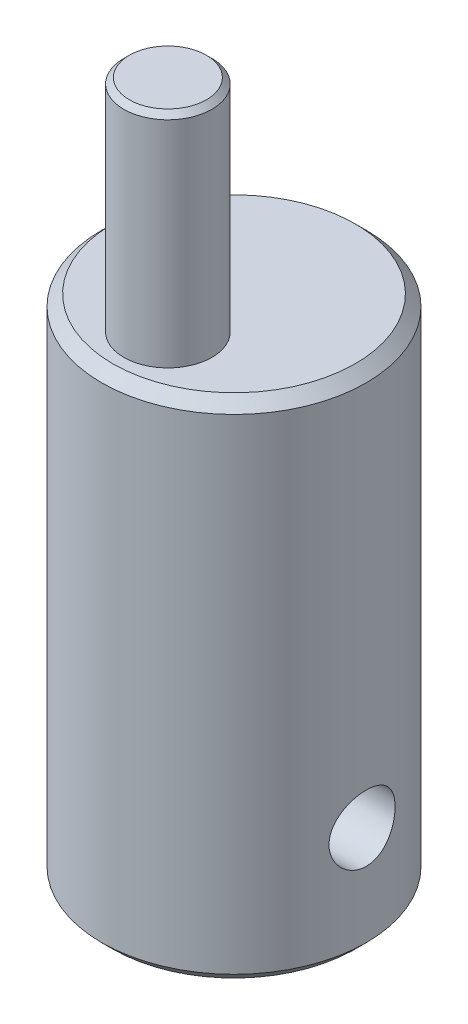
ISO-10303-21;
HEADER;
FILE_DESCRIPTION(('STEP AP214'),'2;1');
FILE_NAME('part.step','',(''),(''),'','','');
FILE_SCHEMA(('AUTOMOTIVE_DESIGN { 1 0 10303 214 1 1 1 1 }'));
ENDSEC;
DATA;
#1=APPLICATION_CONTEXT('core data for automotive mechanical design processes');
#2=APPLICATION_PROTOCOL_DEFINITION('international standard','automotive_design',2000,#1);
#3=PRODUCT_CONTEXT('',#1,'mechanical');
#4=PRODUCT('Part','Part','',(#3));
#5=PRODUCT_RELATED_PRODUCT_CATEGORY('part','',(#4));
#6=PRODUCT_DEFINITION_FORMATION('','',#4);
#7=PRODUCT_DEFINITION_CONTEXT('part definition',#1,'design');
#8=PRODUCT_DEFINITION('design','',#6,#7);
#9=PRODUCT_DEFINITION_SHAPE('','',#8);
#10=(LENGTH_UNIT() NAMED_UNIT(*) SI_UNIT(.MILLI.,.METRE.));
#11=(NAMED_UNIT(*) PLANE_ANGLE_UNIT() SI_UNIT($,.RADIAN.));
#12=(NAMED_UNIT(*) SI_UNIT($,.STERADIAN.) SOLID_ANGLE_UNIT());
#13=UNCERTAINTY_MEASURE_WITH_UNIT(LENGTH_MEASURE(1.E-05),#10,'distance_accuracy_value','');
#14=(GEOMETRIC_REPRESENTATION_CONTEXT(3) GLOBAL_UNCERTAINTY_ASSIGNED_CONTEXT((#13)) GLOBAL_UNIT_ASSIGNED_CONTEXT((#10,
#11,#12)) REPRESENTATION_CONTEXT('',''));
#15=CARTESIAN_POINT('',(0.,0.,0.));
#16=DIRECTION('',(0.,0.,1.));
#17=DIRECTION('',(1.,0.,0.));
#18=AXIS2_PLACEMENT_3D('',#15,#16,#17);
#19=CARTESIAN_POINT('',(0.,23.,0.));
#20=DIRECTION('',(0.,-1.,0.));
#21=DIRECTION('',(0.,0.,-1.));
#22=AXIS2_PLACEMENT_3D('',#19,#20,#21);
#23=CYLINDRICAL_SURFACE('',#22,6.);
#24=CARTESIAN_POINT('',(0.,0.5,0.));
#25=DIRECTION('',(0.,1.,0.));
#26=DIRECTION('',(0.,0.,1.));
#27=AXIS2_PLACEMENT_3D('',#24,#25,#26);
#28=CIRCLE('',#27,6.);
#29=CARTESIAN_POINT('',(0.,0.5,6.));
#30=VERTEX_POINT('',#29);
#31=EDGE_CURVE('E52',#30,#30,#28,.T.);
#32=ORIENTED_EDGE('',*,*,#31,.T.);
#33=EDGE_LOOP('',(#32));
#34=FACE_BOUND('',#33,.T.);
#35=CARTESIAN_POINT('',(0.,22.5,0.));
#36=DIRECTION('',(0.,1.,0.));
#37=DIRECTION('',(0.,0.,1.));
#38=AXIS2_PLACEMENT_3D('',#35,#36,#37);
#39=CIRCLE('',#38,6.);
#40=CARTESIAN_POINT('',(0.,22.5,6.));
#41=VERTEX_POINT('',#40);
#42=EDGE_CURVE('E57',#41,#41,#39,.F.);
#43=ORIENTED_EDGE('',*,*,#42,.T.);
#44=EDGE_LOOP('',(#43));
#45=FACE_BOUND('',#44,.T.);
#46=CARTESIAN_POINT('',(-5.80947501931113,5.,-1.5));
#47=CARTESIAN_POINT('',(-5.80947660051185,5.08283045055477,-1.49999764715507));
#48=CARTESIAN_POINT('',(-5.81126583608348,5.1656869392068,-1.49311574729838));
#49=CARTESIAN_POINT('',(-5.81821117195949,5.32902054690442,-1.46581387527848));
#50=CARTESIAN_POINT('',(-5.82336923173088,5.409496252681,-1.44538602404532));
#51=CARTESIAN_POINT('',(-5.8364323475758,5.56568212291222,-1.39169471977917));
#52=CARTESIAN_POINT('',(-5.84433385614245,5.6413982932314,-1.35844783671268));
#53=CARTESIAN_POINT('',(-5.86198915217285,5.78618651152395,-1.28011268475685));
#54=CARTESIAN_POINT('',(-5.87174301827101,5.85525827724814,-1.23502391313642));
#55=CARTESIAN_POINT('',(-5.89224429813367,5.98631698715732,-1.13322505638713));
#56=CARTESIAN_POINT('',(-5.90300758573818,6.04813616021003,-1.07630213262243));
#57=CARTESIAN_POINT('',(-5.92417725309178,6.16145683661621,-0.952909238460399));
#58=CARTESIAN_POINT('',(-5.93458359939834,6.21295737537305,-0.886438376508184));
#59=CARTESIAN_POINT('',(-5.95404249312349,6.30486528057877,-0.744687120647372));
#60=CARTESIAN_POINT('',(-5.96307412440355,6.34510783289688,-0.669296745717072));
#61=CARTESIAN_POINT('',(-5.97858487155591,6.41228578649185,-0.512557910575657));
#62=CARTESIAN_POINT('',(-5.98506436400607,6.43922315114931,-0.431210331475164));
#63=CARTESIAN_POINT('',(-5.99462855308908,6.47848870074715,-0.266615255252496));
#64=CARTESIAN_POINT('',(-5.99777936306589,6.49110178659595,-0.183439631729385));
#65=CARTESIAN_POINT('',(-6.00056156464379,6.50225502756533,-0.0160972915576611));
#66=CARTESIAN_POINT('',(-6.00019347658022,6.50079726332576,0.0680692767228416));
#67=CARTESIAN_POINT('',(-5.99602856972121,6.48405508984991,0.233028370758581));
#68=CARTESIAN_POINT('',(-5.99230801404524,6.46907820496769,0.313854323401601));
#69=CARTESIAN_POINT('',(-5.98194501914912,6.4262172379709,0.47180737112053));
#70=CARTESIAN_POINT('',(-5.97530242439065,6.39833246877355,0.548934269055657));
#71=CARTESIAN_POINT('',(-5.95972505820537,6.33019845758776,0.69811005525271));
#72=CARTESIAN_POINT('',(-5.95077011817032,6.28983977320295,0.770106764649757));
#73=CARTESIAN_POINT('',(-5.9315394228579,6.19798659253025,0.906413433510733));
#74=CARTESIAN_POINT('',(-5.92126343791494,6.14649015886363,0.970722052628258));
#75=CARTESIAN_POINT('',(-5.90018228261712,6.03217475481057,1.09166105262743));
#76=CARTESIAN_POINT('',(-5.88937031715551,5.96908706459134,1.1480365186128));
#77=CARTESIAN_POINT('',(-5.86869026110024,5.83424001587585,1.24946456394453));
#78=CARTESIAN_POINT('',(-5.85882221463582,5.7624802523054,1.29451661406902));
#79=CARTESIAN_POINT('',(-5.84112298098989,5.61182597951062,1.3721821935339));
#80=CARTESIAN_POINT('',(-5.83330190235432,5.53289856181208,1.40473435045574));
#81=CARTESIAN_POINT('',(-5.82071184083974,5.37044871915413,1.45602843095451));
#82=CARTESIAN_POINT('',(-5.81594220486131,5.28692728161012,1.47477330982936));
#83=CARTESIAN_POINT('',(-5.81013213623485,5.12002429908613,1.49749778319911));
#84=CARTESIAN_POINT('',(-5.80899653456189,5.03669732400222,1.50185428435178));
#85=CARTESIAN_POINT('',(-5.81032406088624,4.8705068380531,1.49671019430933));
#86=CARTESIAN_POINT('',(-5.8127868576076,4.78764328522926,1.48721087870928));
#87=CARTESIAN_POINT('',(-5.82094249172736,4.62613144102718,1.4549552783626));
#88=CARTESIAN_POINT('',(-5.82658182140625,4.54743636405749,1.43241844096905));
#89=CARTESIAN_POINT('',(-5.84040430962577,4.39494112528899,1.37497084900237));
#90=CARTESIAN_POINT('',(-5.84858776949168,4.3211415445668,1.34005862862753));
#91=CARTESIAN_POINT('',(-5.86677682255958,4.17893523327959,1.25806240076193));
#92=CARTESIAN_POINT('',(-5.87681501163985,4.11066269597414,1.21075305230138));
#93=CARTESIAN_POINT('',(-5.8975024984303,3.98288698231919,1.10559043940168));
#94=CARTESIAN_POINT('',(-5.90815189637082,3.92338525000996,1.04773544220816));
#95=CARTESIAN_POINT('',(-5.92918441818964,3.81331337445743,0.921394081477089));
#96=CARTESIAN_POINT('',(-5.93955421237102,3.76300396247071,0.852677928797389));
#97=CARTESIAN_POINT('',(-5.95858329968241,3.67463847982925,0.707554024042013));
#98=CARTESIAN_POINT('',(-5.96724268202376,3.63658177003508,0.631146673436387));
#99=CARTESIAN_POINT('',(-5.98182069442989,3.57413237928324,0.473337302596636));
#100=CARTESIAN_POINT('',(-5.98775898013446,3.54964142937256,0.391976071541822));
#101=CARTESIAN_POINT('',(-5.99631176037473,3.51472379923495,0.226124640478212));
#102=CARTESIAN_POINT('',(-5.99892689636045,3.50429440475657,0.141635047561866));
#103=CARTESIAN_POINT('',(-6.00051254113217,3.4979486156367,-0.0256252896649892));
#104=CARTESIAN_POINT('',(-5.99957968320012,3.50164743635691,-0.108380740449049));
#105=CARTESIAN_POINT('',(-5.99438844686135,3.5225717409415,-0.272051244622109));
#106=CARTESIAN_POINT('',(-5.99013016735643,3.53979682251965,-0.35296635267133));
#107=CARTESIAN_POINT('',(-5.97878149280944,3.58707832965639,-0.510256553467224));
#108=CARTESIAN_POINT('',(-5.97170646753999,3.61706517997194,-0.586653741871528));
#109=CARTESIAN_POINT('',(-5.95546933370076,3.68895586852899,-0.733375579562202));
#110=CARTESIAN_POINT('',(-5.94630696206604,3.73086120900435,-0.803699461897577));
#111=CARTESIAN_POINT('',(-5.92660874521999,3.82657285099561,-0.938102892635849));
#112=CARTESIAN_POINT('',(-5.91604525418417,3.88064021436107,-1.00199248245088));
#113=CARTESIAN_POINT('',(-5.89485973579863,3.9986342779607,-1.11992253040688));
#114=CARTESIAN_POINT('',(-5.88423769428834,4.06256347414686,-1.17396048760228));
#115=CARTESIAN_POINT('',(-5.86391213790822,4.199902121302,-1.27164303971884));
#116=CARTESIAN_POINT('',(-5.85422945594827,4.27346618511894,-1.31507492916982));
#117=CARTESIAN_POINT('',(-5.83715933325924,4.42708323488405,-1.3888903449235));
#118=CARTESIAN_POINT('',(-5.82977022370054,4.50713144916011,-1.41928336463958));
#119=CARTESIAN_POINT('',(-5.81927863109675,4.65586551774007,-1.46163379284816));
#120=CARTESIAN_POINT('',(-5.8156299450082,4.72383974657579,-1.47598975589307));
#121=CARTESIAN_POINT('',(-5.81072757878358,4.86120330349995,-1.4951734388599));
#122=CARTESIAN_POINT('',(-5.80947369434945,4.93059251036759,-1.50000197155828));
#123=CARTESIAN_POINT('',(-5.80947501931113,5.,-1.5));
#124=B_SPLINE_CURVE_WITH_KNOTS('',3,(#46,#47,#48,#49,#50,#51,#52,#53,#54,#55,#56,#57,#58,#59,
#60,#61,#62,#63,#64,#65,#66,#67,#68,#69,#70,#71,#72,#73,#74,#75,#76,#77,#78,#79,#80,#81,#82,#83,
#84,#85,#86,#87,#88,#89,#90,#91,#92,#93,#94,#95,#96,#97,#98,#99,#100,#101,#102,#103,#104,#105,
#106,#107,#108,#109,#110,#111,#112,#113,#114,#115,#116,#117,#118,#119,#120,#121,#122,#123),
.UNSPECIFIED.,.T.,.F.,(4,2,2,2,2,2,2,2,2,2,2,2,2,2,2,2,2,2,2,2,2,2,2,2,2,2,2,2,2,2,2,2,2,2,2,2,
2,2,4),(0.,0.248236465041681,0.4966174448572,0.744678436299612,0.99274996053287,
1.24574372515786,1.4987611288792,1.75530897838752,2.01181895908255,2.26313250597208,
2.51440889199612,2.76010957613368,3.00582334034872,3.25375724552667,3.50173431281348,
3.75642279943147,4.01112318719881,4.26705859205041,4.52293920077728,4.7720614485703,
5.02116076310281,5.26618443005524,5.5112371285285,5.76109707515494,6.01099811331027,
6.26715198579191,6.52329249431732,6.77755243684158,7.03176329345423,7.27910067676474,
7.52643070426189,7.77242925935827,8.01845883442843,8.27038257949243,8.52237018939306,
8.77905886370806,9.03556032819972,9.24358696306398,9.45159585059713),.UNSPECIFIED.);
#125=CARTESIAN_POINT('',(-5.80947501931113,5.,-1.5));
#126=VERTEX_POINT('',#125);
#127=EDGE_CURVE('E77',#126,#126,#124,.T.);
#128=ORIENTED_EDGE('',*,*,#127,.T.);
#129=EDGE_LOOP('',(#128));
#130=FACE_BOUND('',#129,.T.);
#131=CARTESIAN_POINT('',(5.80947501931113,5.,-1.5));
#132=CARTESIAN_POINT('',(5.80947660051185,4.91716954944523,-1.49999764715507));
#133=CARTESIAN_POINT('',(5.81126583608348,4.8343130607932,-1.49311574729838));
#134=CARTESIAN_POINT('',(5.81821117195949,4.67097945309558,-1.46581387527848));
#135=CARTESIAN_POINT('',(5.82336923173088,4.590503747319,-1.44538602404532));
#136=CARTESIAN_POINT('',(5.8364323475758,4.43431787708778,-1.39169471977917));
#137=CARTESIAN_POINT('',(5.84433385614245,4.3586017067686,-1.35844783671268));
#138=CARTESIAN_POINT('',(5.86198915217285,4.21381348847605,-1.28011268475685));
#139=CARTESIAN_POINT('',(5.87174301827101,4.14474172275186,-1.23502391313642));
#140=CARTESIAN_POINT('',(5.89224429813367,4.01368301284268,-1.13322505638713));
#141=CARTESIAN_POINT('',(5.90300758573818,3.95186383978997,-1.07630213262243));
#142=CARTESIAN_POINT('',(5.92417725309178,3.83854316338379,-0.952909238460399));
#143=CARTESIAN_POINT('',(5.93458359939834,3.78704262462695,-0.886438376508185));
#144=CARTESIAN_POINT('',(5.95404249312349,3.69513471942123,-0.744687120647373));
#145=CARTESIAN_POINT('',(5.96307412440355,3.65489216710312,-0.669296745717072));
#146=CARTESIAN_POINT('',(5.97858487155591,3.58771421350815,-0.512557910575657));
#147=CARTESIAN_POINT('',(5.98506436400607,3.56077684885069,-0.431210331475164));
#148=CARTESIAN_POINT('',(5.99462855308908,3.52151129925285,-0.266615255252496));
#149=CARTESIAN_POINT('',(5.99777936306589,3.50889821340405,-0.183439631729385));
#150=CARTESIAN_POINT('',(6.00056156464379,3.49774497243467,-0.0160972915576611));
#151=CARTESIAN_POINT('',(6.00019347658022,3.49920273667424,0.0680692767228415));
#152=CARTESIAN_POINT('',(5.99602856972121,3.51594491015009,0.233028370758581));
#153=CARTESIAN_POINT('',(5.99230801404524,3.53092179503231,0.313854323401601));
#154=CARTESIAN_POINT('',(5.98194501914912,3.5737827620291,0.47180737112053));
#155=CARTESIAN_POINT('',(5.97530242439065,3.60166753122645,0.548934269055657));
#156=CARTESIAN_POINT('',(5.95972505820537,3.66980154241224,0.69811005525271));
#157=CARTESIAN_POINT('',(5.95077011817032,3.71016022679705,0.770106764649757));
#158=CARTESIAN_POINT('',(5.9315394228579,3.80201340746975,0.906413433510733));
#159=CARTESIAN_POINT('',(5.92126343791494,3.85350984113637,0.970722052628258));
#160=CARTESIAN_POINT('',(5.90018228261712,3.96782524518943,1.09166105262743));
#161=CARTESIAN_POINT('',(5.88937031715551,4.03091293540866,1.1480365186128));
#162=CARTESIAN_POINT('',(5.86869026110024,4.16575998412415,1.24946456394453));
#163=CARTESIAN_POINT('',(5.85882221463582,4.2375197476946,1.29451661406902));
#164=CARTESIAN_POINT('',(5.84112298098989,4.38817402048938,1.3721821935339));
#165=CARTESIAN_POINT('',(5.83330190235432,4.46710143818792,1.40473435045574));
#166=CARTESIAN_POINT('',(5.82071184083974,4.62955128084587,1.45602843095451));
#167=CARTESIAN_POINT('',(5.81594220486131,4.71307271838988,1.47477330982936));
#168=CARTESIAN_POINT('',(5.81013213623485,4.87997570091387,1.49749778319911));
#169=CARTESIAN_POINT('',(5.80899653456189,4.96330267599778,1.50185428435178));
#170=CARTESIAN_POINT('',(5.81032406088624,5.1294931619469,1.49671019430933));
#171=CARTESIAN_POINT('',(5.8127868576076,5.21235671477074,1.48721087870928));
#172=CARTESIAN_POINT('',(5.82094249172736,5.37386855897282,1.4549552783626));
#173=CARTESIAN_POINT('',(5.82658182140625,5.45256363594251,1.43241844096905));
#174=CARTESIAN_POINT('',(5.84040430962577,5.60505887471101,1.37497084900237));
#175=CARTESIAN_POINT('',(5.84858776949168,5.6788584554332,1.34005862862753));
#176=CARTESIAN_POINT('',(5.86677682255958,5.82106476672041,1.25806240076193));
#177=CARTESIAN_POINT('',(5.87681501163985,5.88933730402586,1.21075305230138));
#178=CARTESIAN_POINT('',(5.8975024984303,6.01711301768081,1.10559043940168));
#179=CARTESIAN_POINT('',(5.90815189637082,6.07661474999004,1.04773544220816));
#180=CARTESIAN_POINT('',(5.92918441818964,6.18668662554257,0.921394081477089));
#181=CARTESIAN_POINT('',(5.93955421237101,6.23699603752929,0.852677928797389));
#182=CARTESIAN_POINT('',(5.95858329968241,6.32536152017075,0.707554024042013));
#183=CARTESIAN_POINT('',(5.96724268202376,6.36341822996492,0.631146673436387));
#184=CARTESIAN_POINT('',(5.98182069442989,6.42586762071676,0.473337302596636));
#185=CARTESIAN_POINT('',(5.98775898013446,6.45035857062744,0.391976071541822));
#186=CARTESIAN_POINT('',(5.99631176037473,6.48527620076505,0.226124640478212));
#187=CARTESIAN_POINT('',(5.99892689636045,6.49570559524343,0.141635047561865));
#188=CARTESIAN_POINT('',(6.00051254113217,6.5020513843633,-0.0256252896649894));
#189=CARTESIAN_POINT('',(5.99957968320012,6.49835256364309,-0.10838074044905));
#190=CARTESIAN_POINT('',(5.99438844686135,6.4774282590585,-0.272051244622109));
#191=CARTESIAN_POINT('',(5.99013016735643,6.46020317748035,-0.35296635267133));
#192=CARTESIAN_POINT('',(5.97878149280944,6.41292167034361,-0.510256553467224));
#193=CARTESIAN_POINT('',(5.97170646753999,6.38293482002806,-0.586653741871528));
#194=CARTESIAN_POINT('',(5.95546933370076,6.31104413147101,-0.733375579562202));
#195=CARTESIAN_POINT('',(5.94630696206604,6.26913879099565,-0.803699461897577));
#196=CARTESIAN_POINT('',(5.92660874521999,6.17342714900439,-0.938102892635849));
#197=CARTESIAN_POINT('',(5.91604525418417,6.11935978563893,-1.00199248245088));
#198=CARTESIAN_POINT('',(5.89485973579863,6.0013657220393,-1.11992253040688));
#199=CARTESIAN_POINT('',(5.88423769428834,5.93743652585314,-1.17396048760228));
#200=CARTESIAN_POINT('',(5.86391213790822,5.800097878698,-1.27164303971884));
#201=CARTESIAN_POINT('',(5.85422945594827,5.72653381488106,-1.31507492916982));
#202=CARTESIAN_POINT('',(5.83715933325924,5.57291676511595,-1.3888903449235));
#203=CARTESIAN_POINT('',(5.82977022370054,5.49286855083989,-1.41928336463958));
#204=CARTESIAN_POINT('',(5.81927863109675,5.34413448225992,-1.46163379284816));
#205=CARTESIAN_POINT('',(5.8156299450082,5.27616025342421,-1.47598975589307));
#206=CARTESIAN_POINT('',(5.81072757878358,5.13879669650005,-1.4951734388599));
#207=CARTESIAN_POINT('',(5.80947369434945,5.06940748963241,-1.50000197155828));
#208=CARTESIAN_POINT('',(5.80947501931113,5.,-1.5));
#209=B_SPLINE_CURVE_WITH_KNOTS('',3,(#131,#132,#133,#134,#135,#136,#137,#138,#139,#140,#141,
#142,#143,#144,#145,#146,#147,#148,#149,#150,#151,#152,#153,#154,#155,#156,#157,#158,#159,#160,
#161,#162,#163,#164,#165,#166,#167,#168,#169,#170,#171,#172,#173,#174,#175,#176,#177,#178,#179,
#180,#181,#182,#183,#184,#185,#186,#187,#188,#189,#190,#191,#192,#193,#194,#195,#196,#197,#198,
#199,#200,#201,#202,#203,#204,#205,#206,#207,#208),.UNSPECIFIED.,.T.,.F.,(4,2,2,2,2,2,2,2,2,2,2,
2,2,2,2,2,2,2,2,2,2,2,2,2,2,2,2,2,2,2,2,2,2,2,2,2,2,2,4),(0.,0.248236465041681,0.4966174448572,
0.744678436299612,0.99274996053287,1.24574372515786,1.4987611288792,1.75530897838752,
2.01181895908255,2.26313250597208,2.51440889199612,2.76010957613368,3.00582334034872,
3.25375724552667,3.50173431281348,3.75642279943147,4.01112318719881,4.26705859205042,
4.52293920077729,4.7720614485703,5.02116076310281,5.26618443005524,5.5112371285285,
5.76109707515494,6.01099811331027,6.26715198579191,6.52329249431732,6.77755243684157,
7.03176329345423,7.27910067676474,7.52643070426189,7.77242925935826,8.01845883442843,
8.27038257949242,8.52237018939305,8.77905886370806,9.03556032819971,9.24358696306398,
9.45159585059712),.UNSPECIFIED.);
#210=CARTESIAN_POINT('',(5.80947501931113,5.,-1.5));
#211=VERTEX_POINT('',#210);
#212=EDGE_CURVE('E86',#211,#211,#209,.T.);
#213=ORIENTED_EDGE('',*,*,#212,.T.);
#214=EDGE_LOOP('',(#213));
#215=FACE_BOUND('',#214,.T.);
#216=ADVANCED_FACE('F43',(#34,#45,#130,#215),#23,.T.);
#217=CARTESIAN_POINT('',(0.,23.,0.));
#218=DIRECTION('',(0.,1.,0.));
#219=DIRECTION('',(0.,0.,1.));
#220=AXIS2_PLACEMENT_3D('',#217,#218,#219);
#221=PLANE('',#220);
#222=CARTESIAN_POINT('',(0.,23.,0.));
#223=DIRECTION('',(0.,1.,0.));
#224=DIRECTION('',(0.,0.,1.));
#225=AXIS2_PLACEMENT_3D('',#222,#223,#224);
#226=CIRCLE('',#225,5.49999999999999);
#227=CARTESIAN_POINT('',(0.,23.,5.49999999999999));
#228=VERTEX_POINT('',#227);
#229=EDGE_CURVE('E62',#228,#228,#226,.T.);
#230=ORIENTED_EDGE('',*,*,#229,.T.);
#231=EDGE_LOOP('',(#230));
#232=FACE_BOUND('',#231,.T.);
#233=CARTESIAN_POINT('',(0.,23.,3.));
#234=DIRECTION('',(0.,1.,0.));
#235=DIRECTION('',(0.,0.,1.));
#236=AXIS2_PLACEMENT_3D('',#233,#234,#235);
#237=CIRCLE('',#236,2.);
#238=CARTESIAN_POINT('',(0.,23.,5.));
#239=VERTEX_POINT('',#238);
#240=EDGE_CURVE('E76',#239,#239,#237,.T.);
#241=ORIENTED_EDGE('',*,*,#240,.F.);
#242=EDGE_LOOP('',(#241));
#243=FACE_BOUND('',#242,.T.);
#244=ADVANCED_FACE('F110',(#232,#243),#221,.T.);
#245=CARTESIAN_POINT('',(0.,0.,0.));
#246=DIRECTION('',(0.,1.,0.));
#247=DIRECTION('',(0.,0.,1.));
#248=AXIS2_PLACEMENT_3D('',#245,#246,#247);
#249=PLANE('',#248);
#250=CARTESIAN_POINT('',(0.,0.,0.));
#251=DIRECTION('',(0.,1.,0.));
#252=DIRECTION('',(0.,0.,1.));
#253=AXIS2_PLACEMENT_3D('',#250,#251,#252);
#254=CIRCLE('',#253,5.5);
#255=CARTESIAN_POINT('',(0.,0.,5.5));
#256=VERTEX_POINT('',#255);
#257=EDGE_CURVE('E10',#256,#256,#254,.F.);
#258=ORIENTED_EDGE('',*,*,#257,.T.);
#259=EDGE_LOOP('',(#258));
#260=FACE_BOUND('',#259,.T.);
#261=ADVANCED_FACE('F108',(#260),#249,.F.);
#262=CARTESIAN_POINT('',(0.,33.,3.));
#263=DIRECTION('',(0.,-1.,0.));
#264=DIRECTION('',(0.,0.,-1.));
#265=AXIS2_PLACEMENT_3D('',#262,#263,#264);
#266=CYLINDRICAL_SURFACE('',#265,2.);
#267=CARTESIAN_POINT('',(0.,32.75,3.));
#268=DIRECTION('',(0.,1.,0.));
#269=DIRECTION('',(0.,0.,1.));
#270=AXIS2_PLACEMENT_3D('',#267,#268,#269);
#271=CIRCLE('',#270,2.);
#272=CARTESIAN_POINT('',(0.,32.75,5.));
#273=VERTEX_POINT('',#272);
#274=EDGE_CURVE('E68',#273,#273,#271,.F.);
#275=ORIENTED_EDGE('',*,*,#274,.T.);
#276=EDGE_LOOP('',(#275));
#277=FACE_BOUND('',#276,.T.);
#278=ORIENTED_EDGE('',*,*,#240,.T.);
#279=EDGE_LOOP('',(#278));
#280=FACE_BOUND('',#279,.T.);
#281=ADVANCED_FACE('F104',(#277,#280),#266,.T.);
#282=CARTESIAN_POINT('',(0.,33.,3.));
#283=DIRECTION('',(0.,1.,0.));
#284=DIRECTION('',(0.,0.,1.));
#285=AXIS2_PLACEMENT_3D('',#282,#283,#284);
#286=PLANE('',#285);
#287=CARTESIAN_POINT('',(0.,33.,3.));
#288=DIRECTION('',(0.,1.,0.));
#289=DIRECTION('',(0.,0.,1.));
#290=AXIS2_PLACEMENT_3D('',#287,#288,#289);
#291=CIRCLE('',#290,1.75000000000001);
#292=CARTESIAN_POINT('',(0.,33.,4.75000000000001));
#293=VERTEX_POINT('',#292);
#294=EDGE_CURVE('E72',#293,#293,#291,.T.);
#295=ORIENTED_EDGE('',*,*,#294,.T.);
#296=EDGE_LOOP('',(#295));
#297=FACE_BOUND('',#296,.T.);
#298=ADVANCED_FACE('F99',(#297),#286,.T.);
#299=CARTESIAN_POINT('',(-14.5,5.,0.));
#300=DIRECTION('',(1.,0.,0.));
#301=DIRECTION('',(0.,0.,-1.));
#302=AXIS2_PLACEMENT_3D('',#299,#300,#301);
#303=CYLINDRICAL_SURFACE('',#302,1.5);
#304=ORIENTED_EDGE('',*,*,#212,.F.);
#305=EDGE_LOOP('',(#304));
#306=FACE_BOUND('',#305,.T.);
#307=ORIENTED_EDGE('',*,*,#127,.F.);
#308=EDGE_LOOP('',(#307));
#309=FACE_BOUND('',#308,.T.);
#310=ADVANCED_FACE('F94',(#306,#309),#303,.F.);
#311=CARTESIAN_POINT('',(0.,33.,3.));
#312=DIRECTION('',(0.,-1.,0.));
#313=DIRECTION('',(0.,0.,-1.));
#314=AXIS2_PLACEMENT_3D('',#311,#312,#313);
#315=CONICAL_SURFACE('',#314,1.75000000000001,0.785398163397438);
#316=ORIENTED_EDGE('',*,*,#274,.F.);
#317=EDGE_LOOP('',(#316));
#318=FACE_BOUND('',#317,.T.);
#319=ORIENTED_EDGE('',*,*,#294,.F.);
#320=EDGE_LOOP('',(#319));
#321=FACE_BOUND('',#320,.T.);
#322=ADVANCED_FACE('F98',(#318,#321),#315,.T.);
#323=CARTESIAN_POINT('',(0.,23.,0.));
#324=DIRECTION('',(0.,-1.,0.));
#325=DIRECTION('',(0.,0.,-1.));
#326=AXIS2_PLACEMENT_3D('',#323,#324,#325);
#327=CONICAL_SURFACE('',#326,5.49999999999999,0.785398163397447);
#328=ORIENTED_EDGE('',*,*,#42,.F.);
#329=EDGE_LOOP('',(#328));
#330=FACE_BOUND('',#329,.T.);
#331=ORIENTED_EDGE('',*,*,#229,.F.);
#332=EDGE_LOOP('',(#331));
#333=FACE_BOUND('',#332,.T.);
#334=ADVANCED_FACE('F134',(#330,#333),#327,.T.);
#335=CARTESIAN_POINT('',(0.,0.5,0.));
#336=DIRECTION('',(0.,1.,0.));
#337=DIRECTION('',(0.,0.,1.));
#338=AXIS2_PLACEMENT_3D('',#335,#336,#337);
#339=CONICAL_SURFACE('',#338,6.,0.785398163397454);
#340=ORIENTED_EDGE('',*,*,#257,.F.);
#341=EDGE_LOOP('',(#340));
#342=FACE_BOUND('',#341,.T.);
#343=ORIENTED_EDGE('',*,*,#31,.F.);
#344=EDGE_LOOP('',(#343));
#345=FACE_BOUND('',#344,.T.);
#346=ADVANCED_FACE('F46',(#342,#345),#339,.T.);
#347=CLOSED_SHELL('',(#216,#244,#261,#281,#298,#310,#322,#334,#346));
#348=MANIFOLD_SOLID_BREP('B2',#347);
#349=ADVANCED_BREP_SHAPE_REPRESENTATION('',(#18,#348),#14);
#350=SHAPE_DEFINITION_REPRESENTATION(#9,#349);
ENDSEC;
END-ISO-10303-21;
